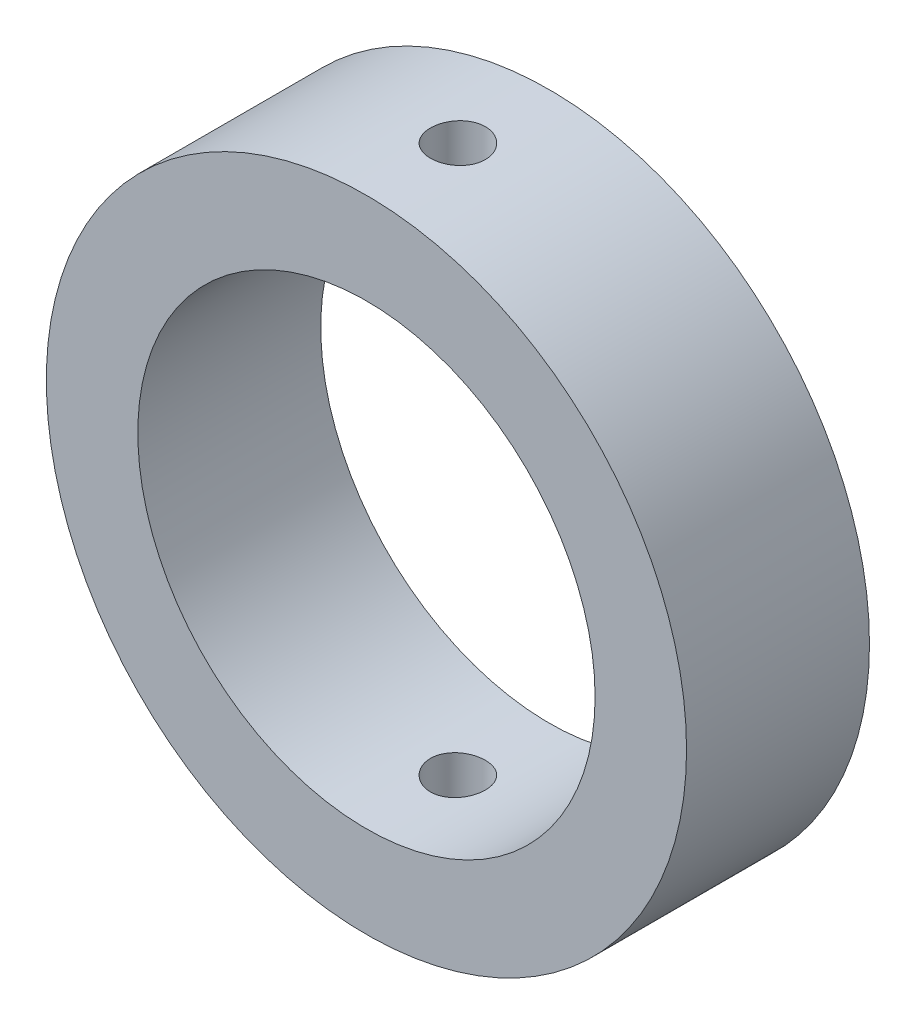
ISO-10303-21;
HEADER;
FILE_DESCRIPTION(('STEP AP214'),'2;1');
FILE_NAME('part.step','',(''),(''),'','','');
FILE_SCHEMA(('AUTOMOTIVE_DESIGN { 1 0 10303 214 1 1 1 1 }'));
ENDSEC;
DATA;
#1=APPLICATION_CONTEXT('core data for automotive mechanical design processes');
#2=APPLICATION_PROTOCOL_DEFINITION('international standard','automotive_design',2000,#1);
#3=PRODUCT_CONTEXT('',#1,'mechanical');
#4=PRODUCT('Part','Part','',(#3));
#5=PRODUCT_RELATED_PRODUCT_CATEGORY('part','',(#4));
#6=PRODUCT_DEFINITION_FORMATION('','',#4);
#7=PRODUCT_DEFINITION_CONTEXT('part definition',#1,'design');
#8=PRODUCT_DEFINITION('design','',#6,#7);
#9=PRODUCT_DEFINITION_SHAPE('','',#8);
#10=(LENGTH_UNIT() NAMED_UNIT(*) SI_UNIT(.MILLI.,.METRE.));
#11=(NAMED_UNIT(*) PLANE_ANGLE_UNIT() SI_UNIT($,.RADIAN.));
#12=(NAMED_UNIT(*) SI_UNIT($,.STERADIAN.) SOLID_ANGLE_UNIT());
#13=UNCERTAINTY_MEASURE_WITH_UNIT(LENGTH_MEASURE(1.E-05),#10,'distance_accuracy_value','');
#14=(GEOMETRIC_REPRESENTATION_CONTEXT(3) GLOBAL_UNCERTAINTY_ASSIGNED_CONTEXT((#13)) GLOBAL_UNIT_ASSIGNED_CONTEXT((#10,
#11,#12)) REPRESENTATION_CONTEXT('',''));
#15=CARTESIAN_POINT('',(0.,0.,0.));
#16=DIRECTION('',(0.,0.,1.));
#17=DIRECTION('',(1.,0.,0.));
#18=AXIS2_PLACEMENT_3D('',#15,#16,#17);
#19=CARTESIAN_POINT('',(0.,0.,20.));
#20=DIRECTION('',(0.,0.,1.));
#21=DIRECTION('',(1.,0.,0.));
#22=AXIS2_PLACEMENT_3D('',#19,#20,#21);
#23=PLANE('',#22);
#24=CARTESIAN_POINT('',(0.,0.,20.));
#25=DIRECTION('',(0.,0.,1.));
#26=DIRECTION('',(1.,0.,0.));
#27=AXIS2_PLACEMENT_3D('',#24,#25,#26);
#28=CIRCLE('',#27,35.);
#29=CARTESIAN_POINT('',(35.,0.,20.));
#30=VERTEX_POINT('',#29);
#31=EDGE_CURVE('E10',#30,#30,#28,.T.);
#32=ORIENTED_EDGE('',*,*,#31,.T.);
#33=EDGE_LOOP('',(#32));
#34=FACE_BOUND('',#33,.T.);
#35=CARTESIAN_POINT('',(0.,0.,20.));
#36=DIRECTION('',(0.,0.,1.));
#37=DIRECTION('',(1.,0.,0.));
#38=AXIS2_PLACEMENT_3D('',#35,#36,#37);
#39=CIRCLE('',#38,25.);
#40=CARTESIAN_POINT('',(25.,0.,20.));
#41=VERTEX_POINT('',#40);
#42=EDGE_CURVE('E54',#41,#41,#39,.T.);
#43=ORIENTED_EDGE('',*,*,#42,.F.);
#44=EDGE_LOOP('',(#43));
#45=FACE_BOUND('',#44,.T.);
#46=ADVANCED_FACE('F35',(#34,#45),#23,.T.);
#47=CARTESIAN_POINT('',(0.,0.,0.));
#48=DIRECTION('',(0.,0.,1.));
#49=DIRECTION('',(1.,0.,0.));
#50=AXIS2_PLACEMENT_3D('',#47,#48,#49);
#51=PLANE('',#50);
#52=CARTESIAN_POINT('',(0.,0.,0.));
#53=DIRECTION('',(0.,0.,1.));
#54=DIRECTION('',(1.,0.,0.));
#55=AXIS2_PLACEMENT_3D('',#52,#53,#54);
#56=CIRCLE('',#55,35.);
#57=CARTESIAN_POINT('',(35.,0.,0.));
#58=VERTEX_POINT('',#57);
#59=EDGE_CURVE('E49',#58,#58,#56,.T.);
#60=ORIENTED_EDGE('',*,*,#59,.F.);
#61=EDGE_LOOP('',(#60));
#62=FACE_BOUND('',#61,.T.);
#63=CARTESIAN_POINT('',(0.,0.,0.));
#64=DIRECTION('',(0.,0.,1.));
#65=DIRECTION('',(1.,0.,0.));
#66=AXIS2_PLACEMENT_3D('',#63,#64,#65);
#67=CIRCLE('',#66,25.);
#68=CARTESIAN_POINT('',(25.,0.,0.));
#69=VERTEX_POINT('',#68);
#70=EDGE_CURVE('E57',#69,#69,#67,.T.);
#71=ORIENTED_EDGE('',*,*,#70,.T.);
#72=EDGE_LOOP('',(#71));
#73=FACE_BOUND('',#72,.T.);
#74=ADVANCED_FACE('F93',(#62,#73),#51,.F.);
#75=CARTESIAN_POINT('',(0.,0.,20.));
#76=DIRECTION('',(0.,0.,-1.));
#77=DIRECTION('',(-1.,0.,0.));
#78=AXIS2_PLACEMENT_3D('',#75,#76,#77);
#79=CYLINDRICAL_SURFACE('',#78,35.);
#80=CARTESIAN_POINT('',(0.,-35.,13.));
#81=CARTESIAN_POINT('',(0.168180177421425,-34.9999983189466,12.9999926621086));
#82=CARTESIAN_POINT('',(0.336474410694065,-34.9987748870089,12.9858101377132));
#83=CARTESIAN_POINT('',(0.668405276387218,-34.9940120055983,12.9294427662291));
#84=CARTESIAN_POINT('',(0.83203643352241,-34.9904699418268,12.8872263096079));
#85=CARTESIAN_POINT('',(1.14978580604665,-34.9814700099417,12.7760219308489));
#86=CARTESIAN_POINT('',(1.30390939390644,-34.9760132356579,12.7070492915307));
#87=CARTESIAN_POINT('',(1.5983553572425,-34.9637955952331,12.5443180840418));
#88=CARTESIAN_POINT('',(1.7386806487592,-34.9570350055299,12.4505647683675));
#89=CARTESIAN_POINT('',(2.00196024172095,-34.9429478698077,12.2406617110507));
#90=CARTESIAN_POINT('',(2.12487233650439,-34.9356200130701,12.1244591132005));
#91=CARTESIAN_POINT('',(2.34947428548936,-34.9212352148941,11.8730679106441));
#92=CARTESIAN_POINT('',(2.45116320107853,-34.9141782854488,11.7378784666713));
#93=CARTESIAN_POINT('',(2.63057608789142,-34.9011203668809,11.4520942390574));
#94=CARTESIAN_POINT('',(2.70826279885841,-34.895121025662,11.3014759820007));
#95=CARTESIAN_POINT('',(2.83722803822898,-34.8848727505605,10.9892731041776));
#96=CARTESIAN_POINT('',(2.88850705745045,-34.8806237841455,10.8276886872931));
#97=CARTESIAN_POINT('',(2.96307845769353,-34.8743684880487,10.4985643557107));
#98=CARTESIAN_POINT('',(2.98643979537529,-34.8723566335604,10.3310401716124));
#99=CARTESIAN_POINT('',(3.00472573441206,-34.8707859372111,9.99443731566983));
#100=CARTESIAN_POINT('',(2.99965089755265,-34.8712270468893,9.82535867460138));
#101=CARTESIAN_POINT('',(2.96126551313284,-34.874507414771,9.49091935009246));
#102=CARTESIAN_POINT('',(2.92802995365881,-34.8773403039272,9.32554998866099));
#103=CARTESIAN_POINT('',(2.83438308452453,-34.8850750500347,9.00274549875546));
#104=CARTESIAN_POINT('',(2.77397149596722,-34.8899769282191,8.84531045172663));
#105=CARTESIAN_POINT('',(2.62760362876988,-34.9013046627491,8.54260489760929));
#106=CARTESIAN_POINT('',(2.54161375570937,-34.9077325210554,8.39735071245931));
#107=CARTESIAN_POINT('',(2.34655446417304,-34.9213861292491,8.12330862382476));
#108=CARTESIAN_POINT('',(2.23748455081154,-34.9286118962437,7.99452107351525));
#109=CARTESIAN_POINT('',(1.99894091774494,-34.9430754969892,7.75663207823613));
#110=CARTESIAN_POINT('',(1.86940237855328,-34.9503132942366,7.64759561833133));
#111=CARTESIAN_POINT('',(1.59382461581758,-34.9639632077666,7.45280656292255));
#112=CARTESIAN_POINT('',(1.44778538038973,-34.9703753234546,7.36705398418778));
#113=CARTESIAN_POINT('',(1.14330913680171,-34.9816527329005,7.2212707481009));
#114=CARTESIAN_POINT('',(0.984870717201056,-34.9865178502383,7.16124302414623));
#115=CARTESIAN_POINT('',(0.660113221128349,-34.9941511080319,7.06865924334512));
#116=CARTESIAN_POINT('',(0.493794317781496,-34.9969192945321,7.03610258328611));
#117=CARTESIAN_POINT('',(0.15856025083397,-35.0000408811527,6.99946669791016));
#118=CARTESIAN_POINT('',(-0.0103450366761302,-35.0004018916599,6.99529772286168));
#119=CARTESIAN_POINT('',(-0.346452104482659,-34.9986887867208,7.01532035576532));
#120=CARTESIAN_POINT('',(-0.513653901587616,-34.9966146953254,7.03951168360929));
#121=CARTESIAN_POINT('',(-0.841351421558966,-34.9902695086844,7.11549382233641));
#122=CARTESIAN_POINT('',(-1.00185687270474,-34.9860017297263,7.16724297716301));
#123=CARTESIAN_POINT('',(-1.31190702245475,-34.9757485102754,7.29682922006561));
#124=CARTESIAN_POINT('',(-1.46145153801856,-34.9697630411066,7.37466674367936));
#125=CARTESIAN_POINT('',(-1.7457428816744,-34.9567262474856,7.55444535294469));
#126=CARTESIAN_POINT('',(-1.88045202960912,-34.9496723123826,7.65644583152676));
#127=CARTESIAN_POINT('',(-2.13086824169311,-34.9352996751561,7.88156921992449));
#128=CARTESIAN_POINT('',(-2.24657495644839,-34.9279809681673,8.00469251803617));
#129=CARTESIAN_POINT('',(-2.45601016602155,-34.9138810732733,8.26895626973909));
#130=CARTESIAN_POINT('',(-2.54968004901865,-34.9071013498897,8.41014326356234));
#131=CARTESIAN_POINT('',(-2.71198063229128,-34.8948680127784,8.70629524502194));
#132=CARTESIAN_POINT('',(-2.78061159495576,-34.8894143851545,8.8612600882557));
#133=CARTESIAN_POINT('',(-2.8907865424564,-34.8804590783593,9.180362211124));
#134=CARTESIAN_POINT('',(-2.93236627395852,-34.8769548240937,9.34448707344406));
#135=CARTESIAN_POINT('',(-2.98737479633476,-34.872286503041,9.67742005737787));
#136=CARTESIAN_POINT('',(-3.0008041627162,-34.871122388412,9.84622808317732));
#137=CARTESIAN_POINT('',(-2.99912392353084,-34.8712668950776,10.1831530647903));
#138=CARTESIAN_POINT('',(-2.98410640669543,-34.8725675374248,10.3512704909289));
#139=CARTESIAN_POINT('',(-2.92615085557176,-34.8774780477604,10.6825859274482));
#140=CARTESIAN_POINT('',(-2.88321277999482,-34.8810879191635,10.8457839305537));
#141=CARTESIAN_POINT('',(-2.7706585792072,-34.8902080316544,11.1626330215739));
#142=CARTESIAN_POINT('',(-2.70104425727074,-34.8957181442861,11.3162847539864));
#143=CARTESIAN_POINT('',(-2.53712384137618,-34.9080181097008,11.6097355757974));
#144=CARTESIAN_POINT('',(-2.4428181018962,-34.9148079441114,11.7495348640265));
#145=CARTESIAN_POINT('',(-2.23184571903132,-34.9289284828144,12.0117838459397));
#146=CARTESIAN_POINT('',(-2.11511080731054,-34.9362607952504,12.1341785330169));
#147=CARTESIAN_POINT('',(-1.86271960746937,-34.9506254222313,12.357688026767));
#148=CARTESIAN_POINT('',(-1.72705875414518,-34.9576576638589,12.4587976843829));
#149=CARTESIAN_POINT('',(-1.44039065385252,-34.9706432183248,12.6370108284413));
#150=CARTESIAN_POINT('',(-1.28935405311577,-34.9765944046818,12.7140672103455));
#151=CARTESIAN_POINT('',(-0.976537475486436,-34.9867226680456,12.8416267776672));
#152=CARTESIAN_POINT('',(-0.814770058056751,-34.9909017781752,12.8921604088507));
#153=CARTESIAN_POINT('',(-0.543377751492647,-34.9959451685553,12.9524054943071));
#154=CARTESIAN_POINT('',(-0.4354969109927,-34.9974587860022,12.9702296244532));
#155=CARTESIAN_POINT('',(-0.218426750644092,-34.999486746251,12.9940292435666));
#156=CARTESIAN_POINT('',(-0.109237434508938,-35.0000010918883,13.0000047661528));
#157=CARTESIAN_POINT('',(0.,-35.,13.));
#158=B_SPLINE_CURVE_WITH_KNOTS('',3,(#80,#81,#82,#83,#84,#85,#86,#87,#88,#89,#90,#91,#92,#93,
#94,#95,#96,#97,#98,#99,#100,#101,#102,#103,#104,#105,#106,#107,#108,#109,#110,#111,#112,#113,
#114,#115,#116,#117,#118,#119,#120,#121,#122,#123,#124,#125,#126,#127,#128,#129,#130,#131,#132,
#133,#134,#135,#136,#137,#138,#139,#140,#141,#142,#143,#144,#145,#146,#147,#148,#149,#150,#151,
#152,#153,#154,#155,#156,#157),.UNSPECIFIED.,.T.,.F.,(4,2,2,2,2,2,2,2,2,2,2,2,2,2,2,2,2,2,2,2,2,
2,2,2,2,2,2,2,2,2,2,2,2,2,2,2,2,2,4),(0.,0.504141688620748,1.0088527873041,1.51327602436422,
2.01759242981481,2.5231110330061,3.0286519884333,3.53497383147415,4.04128626359052,
4.54634550220951,5.05139476290399,5.55510335902216,6.05881712462465,6.56319540924795,
7.06758450992202,7.57360414720597,8.07962414892789,8.58570183661506,9.09176841150507,
9.59623427417642,10.1006951543972,10.6043956535469,11.1081045622491,11.6130646830275,
12.1180340873686,12.6243317573245,13.1306241215114,13.636246082805,14.1418577070399,
14.6458353534656,15.1498137451707,15.6537580747011,16.1576951698375,16.6631911333163,
17.1688092410494,17.6754113983993,18.1814307424438,18.5088849156758,18.8363381597995),.UNSPECIFIED.);
#159=CARTESIAN_POINT('',(0.,-35.,13.));
#160=VERTEX_POINT('',#159);
#161=EDGE_CURVE('E82',#160,#160,#158,.T.);
#162=ORIENTED_EDGE('',*,*,#161,.T.);
#163=EDGE_LOOP('',(#162));
#164=FACE_BOUND('',#163,.T.);
#165=CARTESIAN_POINT('',(0.,35.,13.));
#166=CARTESIAN_POINT('',(-0.168180177421425,34.9999983189466,12.9999926621086));
#167=CARTESIAN_POINT('',(-0.336474410694065,34.9987748870089,12.9858101377132));
#168=CARTESIAN_POINT('',(-0.668405276387218,34.9940120055983,12.9294427662291));
#169=CARTESIAN_POINT('',(-0.83203643352241,34.9904699418268,12.8872263096079));
#170=CARTESIAN_POINT('',(-1.14978580604665,34.9814700099417,12.7760219308489));
#171=CARTESIAN_POINT('',(-1.30390939390644,34.9760132356579,12.7070492915307));
#172=CARTESIAN_POINT('',(-1.5983553572425,34.9637955952331,12.5443180840418));
#173=CARTESIAN_POINT('',(-1.7386806487592,34.9570350055299,12.4505647683675));
#174=CARTESIAN_POINT('',(-2.00196024172095,34.9429478698077,12.2406617110507));
#175=CARTESIAN_POINT('',(-2.12487233650439,34.9356200130701,12.1244591132005));
#176=CARTESIAN_POINT('',(-2.34947428548936,34.9212352148941,11.8730679106441));
#177=CARTESIAN_POINT('',(-2.45116320107853,34.9141782854488,11.7378784666713));
#178=CARTESIAN_POINT('',(-2.63057608789142,34.9011203668809,11.4520942390574));
#179=CARTESIAN_POINT('',(-2.70826279885841,34.895121025662,11.3014759820007));
#180=CARTESIAN_POINT('',(-2.83722803822898,34.8848727505605,10.9892731041776));
#181=CARTESIAN_POINT('',(-2.88850705745045,34.8806237841455,10.8276886872931));
#182=CARTESIAN_POINT('',(-2.96307845769353,34.8743684880487,10.4985643557107));
#183=CARTESIAN_POINT('',(-2.98643979537529,34.8723566335604,10.3310401716124));
#184=CARTESIAN_POINT('',(-3.00472573441206,34.8707859372111,9.99443731566983));
#185=CARTESIAN_POINT('',(-2.99965089755265,34.8712270468893,9.82535867460138));
#186=CARTESIAN_POINT('',(-2.96126551313284,34.874507414771,9.49091935009246));
#187=CARTESIAN_POINT('',(-2.92802995365881,34.8773403039272,9.32554998866099));
#188=CARTESIAN_POINT('',(-2.83438308452453,34.8850750500347,9.00274549875546));
#189=CARTESIAN_POINT('',(-2.77397149596722,34.8899769282191,8.84531045172663));
#190=CARTESIAN_POINT('',(-2.62760362876988,34.9013046627491,8.54260489760929));
#191=CARTESIAN_POINT('',(-2.54161375570937,34.9077325210554,8.39735071245931));
#192=CARTESIAN_POINT('',(-2.34655446417304,34.9213861292491,8.12330862382476));
#193=CARTESIAN_POINT('',(-2.23748455081154,34.9286118962437,7.99452107351525));
#194=CARTESIAN_POINT('',(-1.99894091774494,34.9430754969892,7.75663207823613));
#195=CARTESIAN_POINT('',(-1.86940237855328,34.9503132942366,7.64759561833133));
#196=CARTESIAN_POINT('',(-1.59382461581758,34.9639632077666,7.45280656292255));
#197=CARTESIAN_POINT('',(-1.44778538038973,34.9703753234546,7.36705398418778));
#198=CARTESIAN_POINT('',(-1.14330913680171,34.9816527329005,7.2212707481009));
#199=CARTESIAN_POINT('',(-0.984870717201056,34.9865178502383,7.16124302414623));
#200=CARTESIAN_POINT('',(-0.660113221128349,34.9941511080319,7.06865924334512));
#201=CARTESIAN_POINT('',(-0.493794317781496,34.9969192945321,7.03610258328611));
#202=CARTESIAN_POINT('',(-0.15856025083397,35.0000408811527,6.99946669791016));
#203=CARTESIAN_POINT('',(0.0103450366761302,35.0004018916599,6.99529772286168));
#204=CARTESIAN_POINT('',(0.346452104482659,34.9986887867208,7.01532035576532));
#205=CARTESIAN_POINT('',(0.513653901587616,34.9966146953254,7.03951168360929));
#206=CARTESIAN_POINT('',(0.841351421558966,34.9902695086844,7.11549382233641));
#207=CARTESIAN_POINT('',(1.00185687270474,34.9860017297263,7.16724297716301));
#208=CARTESIAN_POINT('',(1.31190702245475,34.9757485102754,7.29682922006561));
#209=CARTESIAN_POINT('',(1.46145153801856,34.9697630411066,7.37466674367936));
#210=CARTESIAN_POINT('',(1.7457428816744,34.9567262474856,7.55444535294469));
#211=CARTESIAN_POINT('',(1.88045202960912,34.9496723123826,7.65644583152676));
#212=CARTESIAN_POINT('',(2.13086824169311,34.9352996751561,7.88156921992449));
#213=CARTESIAN_POINT('',(2.24657495644839,34.9279809681673,8.00469251803617));
#214=CARTESIAN_POINT('',(2.45601016602155,34.9138810732733,8.26895626973909));
#215=CARTESIAN_POINT('',(2.54968004901865,34.9071013498897,8.41014326356234));
#216=CARTESIAN_POINT('',(2.71198063229128,34.8948680127784,8.70629524502194));
#217=CARTESIAN_POINT('',(2.78061159495576,34.8894143851545,8.8612600882557));
#218=CARTESIAN_POINT('',(2.8907865424564,34.8804590783593,9.180362211124));
#219=CARTESIAN_POINT('',(2.93236627395852,34.8769548240937,9.34448707344406));
#220=CARTESIAN_POINT('',(2.98737479633476,34.872286503041,9.67742005737787));
#221=CARTESIAN_POINT('',(3.0008041627162,34.871122388412,9.84622808317732));
#222=CARTESIAN_POINT('',(2.99912392353084,34.8712668950776,10.1831530647903));
#223=CARTESIAN_POINT('',(2.98410640669543,34.8725675374248,10.3512704909289));
#224=CARTESIAN_POINT('',(2.92615085557176,34.8774780477604,10.6825859274482));
#225=CARTESIAN_POINT('',(2.88321277999482,34.8810879191635,10.8457839305537));
#226=CARTESIAN_POINT('',(2.7706585792072,34.8902080316544,11.1626330215739));
#227=CARTESIAN_POINT('',(2.70104425727074,34.8957181442861,11.3162847539864));
#228=CARTESIAN_POINT('',(2.53712384137618,34.9080181097008,11.6097355757974));
#229=CARTESIAN_POINT('',(2.4428181018962,34.9148079441114,11.7495348640265));
#230=CARTESIAN_POINT('',(2.23184571903132,34.9289284828144,12.0117838459397));
#231=CARTESIAN_POINT('',(2.11511080731054,34.9362607952504,12.1341785330169));
#232=CARTESIAN_POINT('',(1.86271960746937,34.9506254222313,12.357688026767));
#233=CARTESIAN_POINT('',(1.72705875414518,34.9576576638589,12.4587976843829));
#234=CARTESIAN_POINT('',(1.44039065385252,34.9706432183248,12.6370108284413));
#235=CARTESIAN_POINT('',(1.28935405311577,34.9765944046818,12.7140672103455));
#236=CARTESIAN_POINT('',(0.976537475486436,34.9867226680456,12.8416267776672));
#237=CARTESIAN_POINT('',(0.814770058056751,34.9909017781752,12.8921604088507));
#238=CARTESIAN_POINT('',(0.543377751492647,34.9959451685553,12.9524054943071));
#239=CARTESIAN_POINT('',(0.4354969109927,34.9974587860022,12.9702296244532));
#240=CARTESIAN_POINT('',(0.218426750644092,34.999486746251,12.9940292435666));
#241=CARTESIAN_POINT('',(0.109237434508938,35.0000010918883,13.0000047661528));
#242=CARTESIAN_POINT('',(0.,35.,13.));
#243=B_SPLINE_CURVE_WITH_KNOTS('',3,(#165,#166,#167,#168,#169,#170,#171,#172,#173,#174,#175,
#176,#177,#178,#179,#180,#181,#182,#183,#184,#185,#186,#187,#188,#189,#190,#191,#192,#193,#194,
#195,#196,#197,#198,#199,#200,#201,#202,#203,#204,#205,#206,#207,#208,#209,#210,#211,#212,#213,
#214,#215,#216,#217,#218,#219,#220,#221,#222,#223,#224,#225,#226,#227,#228,#229,#230,#231,#232,
#233,#234,#235,#236,#237,#238,#239,#240,#241,#242),.UNSPECIFIED.,.T.,.F.,(4,2,2,2,2,2,2,2,2,2,2,
2,2,2,2,2,2,2,2,2,2,2,2,2,2,2,2,2,2,2,2,2,2,2,2,2,2,2,4),(0.,0.504141688620748,1.0088527873041,
1.51327602436422,2.01759242981481,2.5231110330061,3.0286519884333,3.53497383147415,
4.04128626359052,4.54634550220951,5.05139476290399,5.55510335902216,6.05881712462465,
6.56319540924795,7.06758450992202,7.57360414720597,8.07962414892789,8.58570183661506,
9.09176841150507,9.59623427417642,10.1006951543972,10.6043956535469,11.1081045622491,
11.6130646830275,12.1180340873686,12.6243317573245,13.1306241215114,13.636246082805,
14.1418577070399,14.6458353534656,15.1498137451707,15.6537580747011,16.1576951698375,
16.6631911333163,17.1688092410494,17.6754113983993,18.1814307424438,18.5088849156758,
18.8363381597995),.UNSPECIFIED.);
#244=CARTESIAN_POINT('',(0.,35.,13.));
#245=VERTEX_POINT('',#244);
#246=EDGE_CURVE('E77',#245,#245,#243,.T.);
#247=ORIENTED_EDGE('',*,*,#246,.T.);
#248=EDGE_LOOP('',(#247));
#249=FACE_BOUND('',#248,.T.);
#250=ORIENTED_EDGE('',*,*,#31,.F.);
#251=EDGE_LOOP('',(#250));
#252=FACE_BOUND('',#251,.T.);
#253=ORIENTED_EDGE('',*,*,#59,.T.);
#254=EDGE_LOOP('',(#253));
#255=FACE_BOUND('',#254,.T.);
#256=ADVANCED_FACE('F37',(#164,#249,#252,#255),#79,.T.);
#257=CARTESIAN_POINT('',(0.,0.,20.));
#258=DIRECTION('',(0.,0.,-1.));
#259=DIRECTION('',(-1.,0.,0.));
#260=AXIS2_PLACEMENT_3D('',#257,#258,#259);
#261=CYLINDRICAL_SURFACE('',#260,25.);
#262=CARTESIAN_POINT('',(0.,-25.,13.));
#263=CARTESIAN_POINT('',(0.167864047107699,-24.9999977357459,12.9999928360586));
#264=CARTESIAN_POINT('',(0.335834317331191,-24.9982914200408,12.9858633413073));
#265=CARTESIAN_POINT('',(0.66710457130825,-24.991648705422,12.9297189358446));
#266=CARTESIAN_POINT('',(0.830399429590069,-24.9867088933728,12.8876745587494));
#267=CARTESIAN_POINT('',(1.14747479534053,-24.9741559265426,12.776953723474));
#268=CARTESIAN_POINT('',(1.30126148759225,-24.9665445315309,12.7082947931758));
#269=CARTESIAN_POINT('',(1.595099157832,-24.9494959264345,12.5463312649167));
#270=CARTESIAN_POINT('',(1.73515256713516,-24.9400590404141,12.4530310402467));
#271=CARTESIAN_POINT('',(1.99829131534451,-24.920360105442,12.2439251380248));
#272=CARTESIAN_POINT('',(2.1212966913072,-24.9100945030904,12.1280191598881));
#273=CARTESIAN_POINT('',(2.34615931038342,-24.8899239397152,11.8772070351121));
#274=CARTESIAN_POINT('',(2.44801549826474,-24.8800189967068,11.7422999409814));
#275=CARTESIAN_POINT('',(2.62798342873896,-24.8616560370405,11.4567991747016));
#276=CARTESIAN_POINT('',(2.7060207567257,-24.8532025903971,11.3061582754199));
#277=CARTESIAN_POINT('',(2.8356605730156,-24.8387461344686,10.9937912978913));
#278=CARTESIAN_POINT('',(2.88726398696776,-24.8327430393798,10.8320656080307));
#279=CARTESIAN_POINT('',(2.96232930045399,-24.8239006073737,10.5029471406886));
#280=CARTESIAN_POINT('',(2.98592577987646,-24.8210461452543,10.3355854715723));
#281=CARTESIAN_POINT('',(3.0047237521967,-24.8187777690611,9.99925506363583));
#282=CARTESIAN_POINT('',(2.99992630052848,-24.8193637271033,9.83028638478303));
#283=CARTESIAN_POINT('',(2.96218316078668,-24.8238961466306,9.49647403521565));
#284=CARTESIAN_POINT('',(2.92938543222303,-24.8278249434675,9.33161336131982));
#285=CARTESIAN_POINT('',(2.83680346170067,-24.8385728087608,9.00975297217864));
#286=CARTESIAN_POINT('',(2.77701871225814,-24.8453919315688,8.85275340482101));
#287=CARTESIAN_POINT('',(2.63199980699862,-24.8611722079476,8.55061053176089));
#288=CARTESIAN_POINT('',(2.54670106203925,-24.8701387862198,8.40549852164644));
#289=CARTESIAN_POINT('',(2.35312173169469,-24.8891993987901,8.13159278908424));
#290=CARTESIAN_POINT('',(2.24484017723157,-24.8992934806213,8.00279975509743));
#291=CARTESIAN_POINT('',(2.0075475556218,-24.9195503308637,7.76432891563562));
#292=CARTESIAN_POINT('',(1.87840890051216,-24.929713127424,7.65477803014294));
#293=CARTESIAN_POINT('',(1.60350795893872,-24.9489020798549,7.45888847899969));
#294=CARTESIAN_POINT('',(1.45774563908005,-24.9579282334421,7.37254985998085));
#295=CARTESIAN_POINT('',(1.15363930826285,-24.9738318861702,7.22553671436034));
#296=CARTESIAN_POINT('',(0.995291578715591,-24.9807087472809,7.16486980666956));
#297=CARTESIAN_POINT('',(0.67055602227344,-24.991533065309,7.0710212621491));
#298=CARTESIAN_POINT('',(0.504168542441623,-24.9954806485584,7.03783843999552));
#299=CARTESIAN_POINT('',(0.169174396374217,-24.9999852500304,7.00006374450231));
#300=CARTESIAN_POINT('',(0.000587720432051526,-25.0005630093753,6.9952969675993));
#301=CARTESIAN_POINT('',(-0.33498206824326,-24.9983187823231,7.01402857786827));
#302=CARTESIAN_POINT('',(-0.501965212327328,-24.9954968625308,7.03752641129535));
#303=CARTESIAN_POINT('',(-0.829074263928356,-24.9867833380686,7.11197496400309));
#304=CARTESIAN_POINT('',(-0.989219346369035,-24.9809010237909,7.16284261305008));
#305=CARTESIAN_POINT('',(-1.29870539768646,-24.9667255501792,7.29050070335358));
#306=CARTESIAN_POINT('',(-1.44804602592347,-24.9584323148759,7.36729196149009));
#307=CARTESIAN_POINT('',(-1.73246717766504,-24.9403085158695,7.54504291590243));
#308=CARTESIAN_POINT('',(-1.86747628962751,-24.9304708084643,7.64611613781082));
#309=CARTESIAN_POINT('',(-2.11867625152203,-24.9103817919419,7.86940084640817));
#310=CARTESIAN_POINT('',(-2.23486641472949,-24.9001304677484,7.99161310414795));
#311=CARTESIAN_POINT('',(-2.44574795226154,-24.8803059484942,8.25447561542769));
#312=CARTESIAN_POINT('',(-2.54032363231939,-24.8707365831307,8.39521901534385));
#313=CARTESIAN_POINT('',(-2.70449314429332,-24.8534214993383,8.69069502507556));
#314=CARTESIAN_POINT('',(-2.77408744356074,-24.8456757467943,8.84542737311824));
#315=CARTESIAN_POINT('',(-2.88612996668159,-24.8329105734502,9.1641106088947));
#316=CARTESIAN_POINT('',(-2.92864420159346,-24.8278845275633,9.32803801185939));
#317=CARTESIAN_POINT('',(-2.98553272163516,-24.8211085274587,9.66076896948507));
#318=CARTESIAN_POINT('',(-2.99990820526081,-24.8193584337106,9.82957231615732));
#319=CARTESIAN_POINT('',(-3.00009033817931,-24.819336326607,10.1661127296372));
#320=CARTESIAN_POINT('',(-2.98607873671351,-24.8210421863943,10.3338497257713));
#321=CARTESIAN_POINT('',(-2.93026848672089,-24.8276922947425,10.6645667863942));
#322=CARTESIAN_POINT('',(-2.88846982822067,-24.8326365444656,10.8275468491756));
#323=CARTESIAN_POINT('',(-2.77832739820545,-24.8451996524586,11.1441045388887));
#324=CARTESIAN_POINT('',(-2.70999165570539,-24.8528177016812,11.2976849934955));
#325=CARTESIAN_POINT('',(-2.5487328262801,-24.8698714539139,11.5912277470701));
#326=CARTESIAN_POINT('',(-2.45580952709445,-24.8793071726153,11.7311899284593));
#327=CARTESIAN_POINT('',(-2.24733689647205,-24.8990055122588,11.9944529401088));
#328=CARTESIAN_POINT('',(-2.1316520393015,-24.9092728581347,12.1176461032663));
#329=CARTESIAN_POINT('',(-1.88122093334447,-24.9294354968169,12.342942479566));
#330=CARTESIAN_POINT('',(-1.74647018263601,-24.939330701051,12.4450406976292));
#331=CARTESIAN_POINT('',(-1.46119322465137,-24.9576721709324,12.6255505779989));
#332=CARTESIAN_POINT('',(-1.31061323462417,-24.966113221621,12.7038777257223));
#333=CARTESIAN_POINT('',(-0.99842275168531,-24.9805418519727,12.8340237644426));
#334=CARTESIAN_POINT('',(-0.836824564362144,-24.9865321180615,12.8858716961804));
#335=CARTESIAN_POINT('',(-0.561977101236697,-24.9939268325999,12.9490634203381));
#336=CARTESIAN_POINT('',(-0.450466569753487,-24.996193279433,12.9681374838864));
#337=CARTESIAN_POINT('',(-0.225986735693694,-24.9992306204204,12.993608143491));
#338=CARTESIAN_POINT('',(-0.113017442753625,-25.0000015244492,13.0000048232505));
#339=CARTESIAN_POINT('',(0.,-25.,13.));
#340=B_SPLINE_CURVE_WITH_KNOTS('',3,(#262,#263,#264,#265,#266,#267,#268,#269,#270,#271,#272,
#273,#274,#275,#276,#277,#278,#279,#280,#281,#282,#283,#284,#285,#286,#287,#288,#289,#290,#291,
#292,#293,#294,#295,#296,#297,#298,#299,#300,#301,#302,#303,#304,#305,#306,#307,#308,#309,#310,
#311,#312,#313,#314,#315,#316,#317,#318,#319,#320,#321,#322,#323,#324,#325,#326,#327,#328,#329,
#330,#331,#332,#333,#334,#335,#336,#337,#338,#339),.UNSPECIFIED.,.T.,.F.,(4,2,2,2,2,2,2,2,2,2,2,
2,2,2,2,2,2,2,2,2,2,2,2,2,2,2,2,2,2,2,2,2,2,2,2,2,2,2,4),(0.,0.503179350956159,1.00689069408623,
1.5102708637556,2.01356175441693,2.51913872195878,3.02474090904883,3.53190689496397,
4.03905511999113,4.54375638343279,5.0484388866848,5.55047092912253,6.05251241253396,
6.55583573710536,7.05918028869262,7.56572944640317,8.07227962172601,8.57898002694278,
9.08565857822619,9.58921522624226,10.0927620090108,10.5947890255775,11.0968318630167,
11.6012692178556,12.1057249760356,12.6128207581672,13.119907053063,13.6257524826489,
14.1315763666154,14.6341719319229,15.1367676776234,15.6392114771388,16.1416596143122,
16.6471952402032,17.1528504352009,17.6602829023946,18.1671576479275,18.5059342945627,
18.8447087043981),.UNSPECIFIED.);
#341=CARTESIAN_POINT('',(0.,-25.,13.));
#342=VERTEX_POINT('',#341);
#343=EDGE_CURVE('E40',#342,#342,#340,.T.);
#344=ORIENTED_EDGE('',*,*,#343,.F.);
#345=EDGE_LOOP('',(#344));
#346=FACE_BOUND('',#345,.T.);
#347=CARTESIAN_POINT('',(0.,25.,13.));
#348=CARTESIAN_POINT('',(-0.167864047107699,24.9999977357459,12.9999928360586));
#349=CARTESIAN_POINT('',(-0.335834317331191,24.9982914200408,12.9858633413073));
#350=CARTESIAN_POINT('',(-0.66710457130825,24.991648705422,12.9297189358446));
#351=CARTESIAN_POINT('',(-0.830399429590069,24.9867088933728,12.8876745587494));
#352=CARTESIAN_POINT('',(-1.14747479534053,24.9741559265426,12.776953723474));
#353=CARTESIAN_POINT('',(-1.30126148759225,24.9665445315309,12.7082947931758));
#354=CARTESIAN_POINT('',(-1.595099157832,24.9494959264345,12.5463312649167));
#355=CARTESIAN_POINT('',(-1.73515256713516,24.9400590404141,12.4530310402467));
#356=CARTESIAN_POINT('',(-1.99829131534451,24.920360105442,12.2439251380248));
#357=CARTESIAN_POINT('',(-2.1212966913072,24.9100945030904,12.1280191598881));
#358=CARTESIAN_POINT('',(-2.34615931038342,24.8899239397152,11.8772070351121));
#359=CARTESIAN_POINT('',(-2.44801549826474,24.8800189967068,11.7422999409814));
#360=CARTESIAN_POINT('',(-2.62798342873896,24.8616560370405,11.4567991747016));
#361=CARTESIAN_POINT('',(-2.7060207567257,24.8532025903971,11.3061582754199));
#362=CARTESIAN_POINT('',(-2.8356605730156,24.8387461344686,10.9937912978913));
#363=CARTESIAN_POINT('',(-2.88726398696776,24.8327430393798,10.8320656080307));
#364=CARTESIAN_POINT('',(-2.96232930045399,24.8239006073737,10.5029471406886));
#365=CARTESIAN_POINT('',(-2.98592577987646,24.8210461452543,10.3355854715723));
#366=CARTESIAN_POINT('',(-3.0047237521967,24.8187777690611,9.99925506363583));
#367=CARTESIAN_POINT('',(-2.99992630052848,24.8193637271033,9.83028638478303));
#368=CARTESIAN_POINT('',(-2.96218316078668,24.8238961466306,9.49647403521565));
#369=CARTESIAN_POINT('',(-2.92938543222303,24.8278249434675,9.33161336131982));
#370=CARTESIAN_POINT('',(-2.83680346170067,24.8385728087608,9.00975297217864));
#371=CARTESIAN_POINT('',(-2.77701871225814,24.8453919315688,8.85275340482101));
#372=CARTESIAN_POINT('',(-2.63199980699862,24.8611722079476,8.55061053176089));
#373=CARTESIAN_POINT('',(-2.54670106203925,24.8701387862198,8.40549852164644));
#374=CARTESIAN_POINT('',(-2.35312173169469,24.8891993987901,8.13159278908424));
#375=CARTESIAN_POINT('',(-2.24484017723157,24.8992934806213,8.00279975509743));
#376=CARTESIAN_POINT('',(-2.0075475556218,24.9195503308637,7.76432891563562));
#377=CARTESIAN_POINT('',(-1.87840890051216,24.929713127424,7.65477803014294));
#378=CARTESIAN_POINT('',(-1.60350795893872,24.9489020798549,7.45888847899969));
#379=CARTESIAN_POINT('',(-1.45774563908005,24.9579282334421,7.37254985998085));
#380=CARTESIAN_POINT('',(-1.15363930826285,24.9738318861702,7.22553671436034));
#381=CARTESIAN_POINT('',(-0.995291578715591,24.9807087472809,7.16486980666956));
#382=CARTESIAN_POINT('',(-0.67055602227344,24.991533065309,7.0710212621491));
#383=CARTESIAN_POINT('',(-0.504168542441623,24.9954806485584,7.03783843999552));
#384=CARTESIAN_POINT('',(-0.169174396374217,24.9999852500304,7.00006374450231));
#385=CARTESIAN_POINT('',(-0.000587720432051526,25.0005630093753,6.9952969675993));
#386=CARTESIAN_POINT('',(0.33498206824326,24.9983187823231,7.01402857786827));
#387=CARTESIAN_POINT('',(0.501965212327328,24.9954968625308,7.03752641129535));
#388=CARTESIAN_POINT('',(0.829074263928356,24.9867833380686,7.11197496400309));
#389=CARTESIAN_POINT('',(0.989219346369035,24.9809010237909,7.16284261305008));
#390=CARTESIAN_POINT('',(1.29870539768646,24.9667255501792,7.29050070335358));
#391=CARTESIAN_POINT('',(1.44804602592347,24.9584323148759,7.36729196149009));
#392=CARTESIAN_POINT('',(1.73246717766504,24.9403085158695,7.54504291590243));
#393=CARTESIAN_POINT('',(1.86747628962751,24.9304708084643,7.64611613781082));
#394=CARTESIAN_POINT('',(2.11867625152203,24.9103817919419,7.86940084640817));
#395=CARTESIAN_POINT('',(2.23486641472949,24.9001304677484,7.99161310414795));
#396=CARTESIAN_POINT('',(2.44574795226154,24.8803059484942,8.25447561542769));
#397=CARTESIAN_POINT('',(2.54032363231939,24.8707365831307,8.39521901534385));
#398=CARTESIAN_POINT('',(2.70449314429332,24.8534214993383,8.69069502507556));
#399=CARTESIAN_POINT('',(2.77408744356074,24.8456757467943,8.84542737311824));
#400=CARTESIAN_POINT('',(2.88612996668159,24.8329105734502,9.1641106088947));
#401=CARTESIAN_POINT('',(2.92864420159346,24.8278845275633,9.32803801185939));
#402=CARTESIAN_POINT('',(2.98553272163516,24.8211085274587,9.66076896948507));
#403=CARTESIAN_POINT('',(2.99990820526081,24.8193584337106,9.82957231615732));
#404=CARTESIAN_POINT('',(3.00009033817931,24.819336326607,10.1661127296372));
#405=CARTESIAN_POINT('',(2.98607873671351,24.8210421863943,10.3338497257713));
#406=CARTESIAN_POINT('',(2.93026848672089,24.8276922947425,10.6645667863942));
#407=CARTESIAN_POINT('',(2.88846982822067,24.8326365444656,10.8275468491756));
#408=CARTESIAN_POINT('',(2.77832739820545,24.8451996524586,11.1441045388887));
#409=CARTESIAN_POINT('',(2.70999165570539,24.8528177016812,11.2976849934955));
#410=CARTESIAN_POINT('',(2.5487328262801,24.8698714539139,11.5912277470701));
#411=CARTESIAN_POINT('',(2.45580952709445,24.8793071726153,11.7311899284593));
#412=CARTESIAN_POINT('',(2.24733689647205,24.8990055122588,11.9944529401088));
#413=CARTESIAN_POINT('',(2.1316520393015,24.9092728581347,12.1176461032663));
#414=CARTESIAN_POINT('',(1.88122093334447,24.9294354968169,12.342942479566));
#415=CARTESIAN_POINT('',(1.74647018263601,24.939330701051,12.4450406976292));
#416=CARTESIAN_POINT('',(1.46119322465137,24.9576721709324,12.6255505779989));
#417=CARTESIAN_POINT('',(1.31061323462417,24.966113221621,12.7038777257223));
#418=CARTESIAN_POINT('',(0.99842275168531,24.9805418519727,12.8340237644426));
#419=CARTESIAN_POINT('',(0.836824564362144,24.9865321180615,12.8858716961804));
#420=CARTESIAN_POINT('',(0.561977101236697,24.9939268325999,12.9490634203381));
#421=CARTESIAN_POINT('',(0.450466569753487,24.996193279433,12.9681374838864));
#422=CARTESIAN_POINT('',(0.225986735693694,24.9992306204204,12.993608143491));
#423=CARTESIAN_POINT('',(0.113017442753625,25.0000015244492,13.0000048232505));
#424=CARTESIAN_POINT('',(0.,25.,13.));
#425=B_SPLINE_CURVE_WITH_KNOTS('',3,(#347,#348,#349,#350,#351,#352,#353,#354,#355,#356,#357,
#358,#359,#360,#361,#362,#363,#364,#365,#366,#367,#368,#369,#370,#371,#372,#373,#374,#375,#376,
#377,#378,#379,#380,#381,#382,#383,#384,#385,#386,#387,#388,#389,#390,#391,#392,#393,#394,#395,
#396,#397,#398,#399,#400,#401,#402,#403,#404,#405,#406,#407,#408,#409,#410,#411,#412,#413,#414,
#415,#416,#417,#418,#419,#420,#421,#422,#423,#424),.UNSPECIFIED.,.T.,.F.,(4,2,2,2,2,2,2,2,2,2,2,
2,2,2,2,2,2,2,2,2,2,2,2,2,2,2,2,2,2,2,2,2,2,2,2,2,2,2,4),(0.,0.503179350956159,1.00689069408623,
1.5102708637556,2.01356175441693,2.51913872195878,3.02474090904883,3.53190689496397,
4.03905511999113,4.54375638343279,5.0484388866848,5.55047092912253,6.05251241253396,
6.55583573710536,7.05918028869262,7.56572944640317,8.07227962172601,8.57898002694278,
9.08565857822619,9.58921522624226,10.0927620090108,10.5947890255775,11.0968318630167,
11.6012692178556,12.1057249760356,12.6128207581672,13.119907053063,13.6257524826489,
14.1315763666154,14.6341719319229,15.1367676776234,15.6392114771388,16.1416596143122,
16.6471952402032,17.1528504352009,17.6602829023946,18.1671576479275,18.5059342945627,
18.8447087043981),.UNSPECIFIED.);
#426=CARTESIAN_POINT('',(0.,25.,13.));
#427=VERTEX_POINT('',#426);
#428=EDGE_CURVE('E59',#427,#427,#425,.T.);
#429=ORIENTED_EDGE('',*,*,#428,.F.);
#430=EDGE_LOOP('',(#429));
#431=FACE_BOUND('',#430,.T.);
#432=ORIENTED_EDGE('',*,*,#42,.T.);
#433=EDGE_LOOP('',(#432));
#434=FACE_BOUND('',#433,.T.);
#435=ORIENTED_EDGE('',*,*,#70,.F.);
#436=EDGE_LOOP('',(#435));
#437=FACE_BOUND('',#436,.T.);
#438=ADVANCED_FACE('F64',(#346,#431,#434,#437),#261,.F.);
#439=CARTESIAN_POINT('',(0.,-35.,10.));
#440=DIRECTION('',(0.,1.,0.));
#441=DIRECTION('',(0.,0.,1.));
#442=AXIS2_PLACEMENT_3D('',#439,#440,#441);
#443=CYLINDRICAL_SURFACE('',#442,3.);
#444=ORIENTED_EDGE('',*,*,#428,.T.);
#445=EDGE_LOOP('',(#444));
#446=FACE_BOUND('',#445,.T.);
#447=ORIENTED_EDGE('',*,*,#246,.F.);
#448=EDGE_LOOP('',(#447));
#449=FACE_BOUND('',#448,.T.);
#450=ADVANCED_FACE('F70',(#446,#449),#443,.F.);
#451=ORIENTED_EDGE('',*,*,#343,.T.);
#452=EDGE_LOOP('',(#451));
#453=FACE_BOUND('',#452,.T.);
#454=ORIENTED_EDGE('',*,*,#161,.F.);
#455=EDGE_LOOP('',(#454));
#456=FACE_BOUND('',#455,.T.);
#457=ADVANCED_FACE('F67',(#453,#456),#443,.F.);
#458=CLOSED_SHELL('',(#46,#74,#256,#438,#450,#457));
#459=MANIFOLD_SOLID_BREP('B2',#458);
#460=ADVANCED_BREP_SHAPE_REPRESENTATION('',(#18,#459),#14);
#461=SHAPE_DEFINITION_REPRESENTATION(#9,#460);
ENDSEC;
END-ISO-10303-21;
